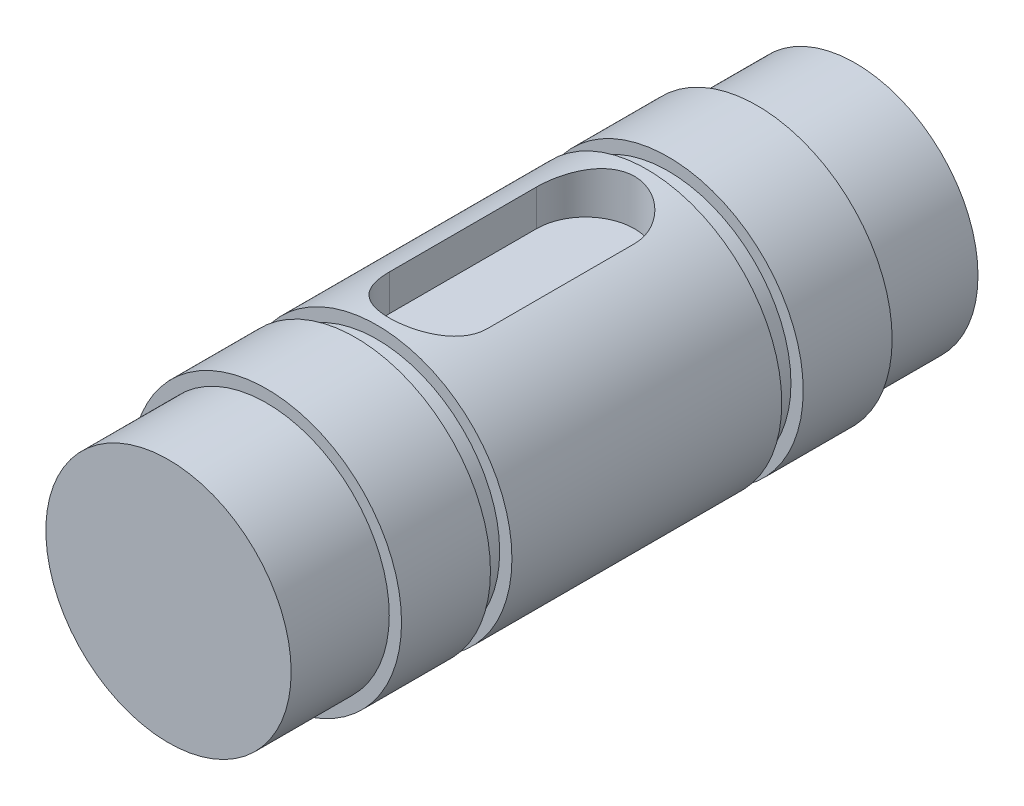
ISO-10303-21;
HEADER;
FILE_DESCRIPTION(('STEP AP214'),'2;1');
FILE_NAME('part.step','',(''),(''),'','','');
FILE_SCHEMA(('AUTOMOTIVE_DESIGN { 1 0 10303 214 1 1 1 1 }'));
ENDSEC;
DATA;
#1=APPLICATION_CONTEXT('core data for automotive mechanical design processes');
#2=APPLICATION_PROTOCOL_DEFINITION('international standard','automotive_design',2000,#1);
#3=PRODUCT_CONTEXT('',#1,'mechanical');
#4=PRODUCT('Part','Part','',(#3));
#5=PRODUCT_RELATED_PRODUCT_CATEGORY('part','',(#4));
#6=PRODUCT_DEFINITION_FORMATION('','',#4);
#7=PRODUCT_DEFINITION_CONTEXT('part definition',#1,'design');
#8=PRODUCT_DEFINITION('design','',#6,#7);
#9=PRODUCT_DEFINITION_SHAPE('','',#8);
#10=(LENGTH_UNIT() NAMED_UNIT(*) SI_UNIT(.MILLI.,.METRE.));
#11=(NAMED_UNIT(*) PLANE_ANGLE_UNIT() SI_UNIT($,.RADIAN.));
#12=(NAMED_UNIT(*) SI_UNIT($,.STERADIAN.) SOLID_ANGLE_UNIT());
#13=UNCERTAINTY_MEASURE_WITH_UNIT(LENGTH_MEASURE(1.E-05),#10,'distance_accuracy_value','');
#14=(GEOMETRIC_REPRESENTATION_CONTEXT(3) GLOBAL_UNCERTAINTY_ASSIGNED_CONTEXT((#13)) GLOBAL_UNIT_ASSIGNED_CONTEXT((#10,
#11,#12)) REPRESENTATION_CONTEXT('',''));
#15=CARTESIAN_POINT('',(0.,0.,0.));
#16=DIRECTION('',(0.,0.,1.));
#17=DIRECTION('',(1.,0.,0.));
#18=AXIS2_PLACEMENT_3D('',#15,#16,#17);
#19=CARTESIAN_POINT('',(0.,0.,20.));
#20=DIRECTION('',(0.,0.,-1.));
#21=DIRECTION('',(-1.,0.,0.));
#22=AXIS2_PLACEMENT_3D('',#19,#20,#21);
#23=CYLINDRICAL_SURFACE('',#22,11.);
#24=CARTESIAN_POINT('',(0.,0.,11.));
#25=DIRECTION('',(0.,0.,1.));
#26=DIRECTION('',(1.,0.,0.));
#27=AXIS2_PLACEMENT_3D('',#24,#25,#26);
#28=CIRCLE('',#27,11.);
#29=CARTESIAN_POINT('',(11.,0.,11.));
#30=VERTEX_POINT('',#29);
#31=EDGE_CURVE('E113',#30,#30,#28,.T.);
#32=ORIENTED_EDGE('',*,*,#31,.F.);
#33=EDGE_LOOP('',(#32));
#34=FACE_BOUND('',#33,.T.);
#35=CARTESIAN_POINT('',(4.,10.2469507659596,-6.));
#36=CARTESIAN_POINT('',(4.00001506629618,10.2469313120545,-6.10847755884303));
#37=CARTESIAN_POINT('',(3.99558759654818,10.2486728711533,-6.21694440137105));
#38=CARTESIAN_POINT('',(3.97796511816532,10.2555329689245,-6.43302261836809));
#39=CARTESIAN_POINT('',(3.96477288617617,10.260650438117,-6.54063425284187));
#40=CARTESIAN_POINT('',(3.92979740032967,10.2740947544928,-6.75387727573529));
#41=CARTESIAN_POINT('',(3.90804329121767,10.2824107118169,-6.85951412168963));
#42=CARTESIAN_POINT('',(3.85617600406601,10.3019741161438,-7.06841189769306));
#43=CARTESIAN_POINT('',(3.82606243666696,10.3132216996918,-7.17167271683103));
#44=CARTESIAN_POINT('',(3.72361404417548,10.3508476988465,-7.47667611577799));
#45=CARTESIAN_POINT('',(3.6391113549248,10.3811339859163,-7.67400157027245));
#46=CARTESIAN_POINT('',(3.44036098803053,10.4486780931695,-8.05172943459006));
#47=CARTESIAN_POINT('',(3.32609068287348,10.485941210624,-8.23211882813923));
#48=CARTESIAN_POINT('',(3.0653542941641,10.5651741933544,-8.57927479117736));
#49=CARTESIAN_POINT('',(2.91773340595898,10.6072762987954,-8.74514569335533));
#50=CARTESIAN_POINT('',(2.59694586086137,10.6903365397361,-9.05039678297012));
#51=CARTESIAN_POINT('',(2.42377439039871,10.731294457945,-9.18977196743197));
#52=CARTESIAN_POINT('',(2.05001939238179,10.8090212550311,-9.44236320126538));
#53=CARTESIAN_POINT('',(1.84874018053143,10.845615877207,-9.55460837161861));
#54=CARTESIAN_POINT('',(1.42859821417924,10.9089021162938,-9.7432716683795));
#55=CARTESIAN_POINT('',(1.20974170951164,10.9355972343031,-9.81970246356845));
#56=CARTESIAN_POINT('',(0.770126116610719,10.9751354864474,-9.93144020430173));
#57=CARTESIAN_POINT('',(0.549808811706299,10.9884992496064,-9.96829749176194));
#58=CARTESIAN_POINT('',(0.105733961474889,11.0017318475325,-10.004798750743));
#59=CARTESIAN_POINT('',(-0.118022575285701,11.0016045658519,-10.0044534314614));
#60=CARTESIAN_POINT('',(-0.551545099906522,10.9882062518061,-9.96748382097402));
#61=CARTESIAN_POINT('',(-0.761477378236625,10.9755475501487,-9.93254965293703));
#62=CARTESIAN_POINT('',(-1.17226394649134,10.9393023123449,-9.83022333682287));
#63=CARTESIAN_POINT('',(-1.37311772136676,10.9157151570485,-9.76282934973016));
#64=CARTESIAN_POINT('',(-1.76343292952034,10.8595473870101,-9.59665837324836));
#65=CARTESIAN_POINT('',(-1.95269147493231,10.8268435212879,-9.49744827250839));
#66=CARTESIAN_POINT('',(-2.31233599066249,10.7557777457742,-9.27082630306202));
#67=CARTESIAN_POINT('',(-2.48271605149533,10.7174140730196,-9.14340564088477));
#68=CARTESIAN_POINT('',(-2.80972574444224,10.6365116612934,-8.85577759248491));
#69=CARTESIAN_POINT('',(-2.96507569246687,10.5938593571807,-8.69414776985871));
#70=CARTESIAN_POINT('',(-3.24700232649086,10.5108815019074,-8.34669408834143));
#71=CARTESIAN_POINT('',(-3.37356836574825,10.4705568158001,-8.16086131697851));
#72=CARTESIAN_POINT('',(-3.54016240956462,10.4149302410634,-7.86558976536919));
#73=CARTESIAN_POINT('',(-3.59223322579723,10.3970384333424,-7.76325823832066));
#74=CARTESIAN_POINT('',(-3.68750228530319,10.3636323383352,-7.5541882051343));
#75=CARTESIAN_POINT('',(-3.73070428236142,10.3481170458825,-7.44745158655047));
#76=CARTESIAN_POINT('',(-3.80779139446806,10.3200005007808,-7.23043618895911));
#77=CARTESIAN_POINT('',(-3.84168714521911,10.3073959242428,-7.12016161572951));
#78=CARTESIAN_POINT('',(-3.8998727091522,10.2855215725494,-6.89682897033679));
#79=CARTESIAN_POINT('',(-3.92416687098899,10.2762502878854,-6.78377218296894));
#80=CARTESIAN_POINT('',(-3.96229165305801,10.2616115978763,-6.5592786141836));
#81=CARTESIAN_POINT('',(-3.97642329254164,10.2561320834074,-6.44790025783854));
#82=CARTESIAN_POINT('',(-3.99528154959869,10.2487922541277,-6.2243510659218));
#83=CARTESIAN_POINT('',(-4.00001800323396,10.2469281542918,-6.11218118266163));
#84=CARTESIAN_POINT('',(-4.,10.2469507659596,-6.));
#85=B_SPLINE_CURVE_WITH_KNOTS('',3,(#35,#36,#37,#38,#39,#40,#41,#42,#43,#44,#45,#46,#47,#48,#49,
#50,#51,#52,#53,#54,#55,#56,#57,#58,#59,#60,#61,#62,#63,#64,#65,#66,#67,#68,#69,#70,#71,#72,#73,
#74,#75,#76,#77,#78,#79,#80,#81,#82,#83,#84),.UNSPECIFIED.,.F.,.F.,(4,2,2,2,2,2,2,2,2,2,2,2,2,2,
2,2,2,2,2,2,2,2,2,2,4),(0.,0.325310395428346,0.650517782781825,0.974627603491258,
1.29875252283213,1.94591304532233,2.59356694227547,3.26854149378252,3.94364336903227,
4.64017640395484,5.33646286474439,6.00434645390944,6.67203778562602,7.30863725983086,
7.94527280491034,8.59097152050376,9.23687178993661,9.9184556128784,10.6002911350355,
10.9485318545547,11.2966248736591,11.6443184006235,11.9918542727889,12.3286166822483,
12.665026340001),.UNSPECIFIED.);
#86=CARTESIAN_POINT('',(4.,10.2469507659596,-6.));
#87=VERTEX_POINT('',#86);
#88=CARTESIAN_POINT('',(-4.,10.2469507659596,-6.));
#89=VERTEX_POINT('',#88);
#90=EDGE_CURVE('E152',#87,#89,#85,.T.);
#91=ORIENTED_EDGE('',*,*,#90,.F.);
#92=DIRECTION('',(0.,0.,-1.));
#93=VECTOR('',#92,1.);
#94=CARTESIAN_POINT('',(4.,10.2469507659596,20.));
#95=LINE('',#94,#93);
#96=CARTESIAN_POINT('',(4.,10.2469507659596,6.));
#97=VERTEX_POINT('',#96);
#98=EDGE_CURVE('E12',#87,#97,#95,.F.);
#99=ORIENTED_EDGE('',*,*,#98,.T.);
#100=CARTESIAN_POINT('',(4.,10.2469507659596,6.));
#101=CARTESIAN_POINT('',(4.00001506629618,10.2469313120545,6.10847755884303));
#102=CARTESIAN_POINT('',(3.99558759654818,10.2486728711533,6.21694440137105));
#103=CARTESIAN_POINT('',(3.97796511816532,10.2555329689245,6.43302261836809));
#104=CARTESIAN_POINT('',(3.96477288617617,10.260650438117,6.54063425284187));
#105=CARTESIAN_POINT('',(3.92979740032967,10.2740947544928,6.75387727573528));
#106=CARTESIAN_POINT('',(3.90804329121767,10.2824107118169,6.85951412168963));
#107=CARTESIAN_POINT('',(3.85617600406601,10.3019741161438,7.06841189769305));
#108=CARTESIAN_POINT('',(3.82606243666696,10.3132216996918,7.17167271683103));
#109=CARTESIAN_POINT('',(3.72361404417548,10.3508476988465,7.47667611577799));
#110=CARTESIAN_POINT('',(3.63911135492481,10.3811339859163,7.67400157027245));
#111=CARTESIAN_POINT('',(3.44036098803054,10.4486780931695,8.05172943459006));
#112=CARTESIAN_POINT('',(3.32609068287348,10.485941210624,8.23211882813923));
#113=CARTESIAN_POINT('',(3.0653542941641,10.5651741933544,8.57927479117736));
#114=CARTESIAN_POINT('',(2.91773340595898,10.6072762987954,8.74514569335533));
#115=CARTESIAN_POINT('',(2.59694586086137,10.690336539736,9.05039678297012));
#116=CARTESIAN_POINT('',(2.42377439039872,10.731294457945,9.18977196743197));
#117=CARTESIAN_POINT('',(2.0500193923818,10.8090212550311,9.44236320126538));
#118=CARTESIAN_POINT('',(1.84874018053143,10.845615877207,9.5546083716186));
#119=CARTESIAN_POINT('',(1.42859821417925,10.9089021162938,9.7432716683795));
#120=CARTESIAN_POINT('',(1.20974170951164,10.9355972343031,9.81970246356844));
#121=CARTESIAN_POINT('',(0.770126116610723,10.9751354864474,9.93144020430173));
#122=CARTESIAN_POINT('',(0.549808811706303,10.9884992496064,9.96829749176194));
#123=CARTESIAN_POINT('',(0.105733961474892,11.0017318475325,10.004798750743));
#124=CARTESIAN_POINT('',(-0.118022575285698,11.0016045658519,10.0044534314614));
#125=CARTESIAN_POINT('',(-0.551545099906519,10.9882062518061,9.96748382097402));
#126=CARTESIAN_POINT('',(-0.761477378236622,10.9755475501487,9.93254965293702));
#127=CARTESIAN_POINT('',(-1.17226394649134,10.9393023123449,9.83022333682286));
#128=CARTESIAN_POINT('',(-1.37311772136676,10.9157151570485,9.76282934973016));
#129=CARTESIAN_POINT('',(-1.76343292952034,10.8595473870101,9.59665837324835));
#130=CARTESIAN_POINT('',(-1.95269147493231,10.8268435212879,9.49744827250838));
#131=CARTESIAN_POINT('',(-2.31233599066249,10.7557777457742,9.27082630306202));
#132=CARTESIAN_POINT('',(-2.48271605149532,10.7174140730196,9.14340564088477));
#133=CARTESIAN_POINT('',(-2.80972574444224,10.6365116612934,8.8557775924849));
#134=CARTESIAN_POINT('',(-2.96507569246687,10.5938593571807,8.69414776985871));
#135=CARTESIAN_POINT('',(-3.24700232649085,10.5108815019074,8.34669408834142));
#136=CARTESIAN_POINT('',(-3.37356836574825,10.4705568158001,8.16086131697851));
#137=CARTESIAN_POINT('',(-3.54016240956462,10.4149302410634,7.86558976536919));
#138=CARTESIAN_POINT('',(-3.59223322579723,10.3970384333424,7.76325823832065));
#139=CARTESIAN_POINT('',(-3.68750228530319,10.3636323383352,7.5541882051343));
#140=CARTESIAN_POINT('',(-3.73070428236142,10.3481170458825,7.44745158655047));
#141=CARTESIAN_POINT('',(-3.80779139446805,10.3200005007808,7.2304361889591));
#142=CARTESIAN_POINT('',(-3.8416871452191,10.3073959242428,7.1201616157295));
#143=CARTESIAN_POINT('',(-3.8998727091522,10.2855215725494,6.89682897033679));
#144=CARTESIAN_POINT('',(-3.92416687098898,10.2762502878854,6.78377218296893));
#145=CARTESIAN_POINT('',(-3.96229165305801,10.2616115978763,6.55927861418359));
#146=CARTESIAN_POINT('',(-3.97642329254164,10.2561320834074,6.44790025783854));
#147=CARTESIAN_POINT('',(-3.99528154959869,10.2487922541277,6.2243510659218));
#148=CARTESIAN_POINT('',(-4.00001800323396,10.2469281542918,6.11218118266163));
#149=CARTESIAN_POINT('',(-4.,10.2469507659596,6.));
#150=B_SPLINE_CURVE_WITH_KNOTS('',3,(#100,#101,#102,#103,#104,#105,#106,#107,#108,#109,#110,
#111,#112,#113,#114,#115,#116,#117,#118,#119,#120,#121,#122,#123,#124,#125,#126,#127,#128,#129,
#130,#131,#132,#133,#134,#135,#136,#137,#138,#139,#140,#141,#142,#143,#144,#145,#146,#147,#148,
#149),.UNSPECIFIED.,.F.,.F.,(4,2,2,2,2,2,2,2,2,2,2,2,2,2,2,2,2,2,2,2,2,2,2,2,4),(0.,
0.325310395428347,0.650517782781825,0.974627603491257,1.29875252283213,1.94591304532233,
2.59356694227547,3.26854149378252,3.94364336903227,4.64017640395484,5.33646286474438,
6.00434645390944,6.67203778562602,7.30863725983085,7.94527280491034,8.59097152050376,
9.23687178993661,9.91845561287839,10.6002911350355,10.9485318545547,11.2966248736591,
11.6443184006235,11.9918542727889,12.3286166822483,12.665026340001),.UNSPECIFIED.);
#151=CARTESIAN_POINT('',(-4.,10.2469507659596,6.));
#152=VERTEX_POINT('',#151);
#153=EDGE_CURVE('E51',#97,#152,#150,.T.);
#154=ORIENTED_EDGE('',*,*,#153,.T.);
#155=DIRECTION('',(0.,0.,-1.));
#156=VECTOR('',#155,1.);
#157=CARTESIAN_POINT('',(-4.,10.2469507659596,20.));
#158=LINE('',#157,#156);
#159=EDGE_CURVE('E66',#89,#152,#158,.F.);
#160=ORIENTED_EDGE('',*,*,#159,.F.);
#161=EDGE_LOOP('',(#91,#99,#154,#160));
#162=FACE_BOUND('',#161,.T.);
#163=CARTESIAN_POINT('',(0.,0.,-11.));
#164=DIRECTION('',(0.,0.,-1.));
#165=DIRECTION('',(-1.,0.,0.));
#166=AXIS2_PLACEMENT_3D('',#163,#164,#165);
#167=CIRCLE('',#166,11.);
#168=CARTESIAN_POINT('',(-11.,0.,-11.));
#169=VERTEX_POINT('',#168);
#170=EDGE_CURVE('E225',#169,#169,#167,.T.);
#171=ORIENTED_EDGE('',*,*,#170,.F.);
#172=EDGE_LOOP('',(#171));
#173=FACE_BOUND('',#172,.T.);
#174=ADVANCED_FACE('F40',(#34,#162,#173),#23,.T.);
#175=CARTESIAN_POINT('',(0.,0.,12.75));
#176=DIRECTION('',(0.,0.,1.));
#177=DIRECTION('',(1.,0.,0.));
#178=AXIS2_PLACEMENT_3D('',#175,#176,#177);
#179=CIRCLE('',#178,11.);
#180=CARTESIAN_POINT('',(11.,0.,12.75));
#181=VERTEX_POINT('',#180);
#182=EDGE_CURVE('E109',#181,#181,#179,.T.);
#183=ORIENTED_EDGE('',*,*,#182,.T.);
#184=EDGE_LOOP('',(#183));
#185=FACE_BOUND('',#184,.T.);
#186=CARTESIAN_POINT('',(0.,0.,20.));
#187=DIRECTION('',(0.,0.,1.));
#188=DIRECTION('',(1.,0.,0.));
#189=AXIS2_PLACEMENT_3D('',#186,#187,#188);
#190=CIRCLE('',#189,11.);
#191=CARTESIAN_POINT('',(11.,0.,20.));
#192=VERTEX_POINT('',#191);
#193=EDGE_CURVE('E147',#192,#192,#190,.T.);
#194=ORIENTED_EDGE('',*,*,#193,.F.);
#195=EDGE_LOOP('',(#194));
#196=FACE_BOUND('',#195,.T.);
#197=ADVANCED_FACE('F42',(#185,#196),#23,.T.);
#198=CARTESIAN_POINT('',(0.,0.,20.));
#199=DIRECTION('',(0.,0.,1.));
#200=DIRECTION('',(1.,0.,0.));
#201=AXIS2_PLACEMENT_3D('',#198,#199,#200);
#202=PLANE('',#201);
#203=CARTESIAN_POINT('',(0.,0.,20.));
#204=DIRECTION('',(0.,0.,1.));
#205=DIRECTION('',(1.,0.,0.));
#206=AXIS2_PLACEMENT_3D('',#203,#204,#205);
#207=CIRCLE('',#206,10.);
#208=CARTESIAN_POINT('',(10.,0.,20.));
#209=VERTEX_POINT('',#208);
#210=EDGE_CURVE('E148',#209,#209,#207,.T.);
#211=ORIENTED_EDGE('',*,*,#210,.F.);
#212=EDGE_LOOP('',(#211));
#213=FACE_BOUND('',#212,.T.);
#214=ORIENTED_EDGE('',*,*,#193,.T.);
#215=EDGE_LOOP('',(#214));
#216=FACE_BOUND('',#215,.T.);
#217=ADVANCED_FACE('F195',(#213,#216),#202,.T.);
#218=CARTESIAN_POINT('',(0.,0.,28.));
#219=DIRECTION('',(0.,0.,-1.));
#220=DIRECTION('',(-1.,0.,0.));
#221=AXIS2_PLACEMENT_3D('',#218,#219,#220);
#222=CYLINDRICAL_SURFACE('',#221,10.);
#223=CARTESIAN_POINT('',(0.,0.,28.));
#224=DIRECTION('',(0.,0.,1.));
#225=DIRECTION('',(1.,0.,0.));
#226=AXIS2_PLACEMENT_3D('',#223,#224,#225);
#227=CIRCLE('',#226,10.);
#228=CARTESIAN_POINT('',(10.,0.,28.));
#229=VERTEX_POINT('',#228);
#230=EDGE_CURVE('E140',#229,#229,#227,.T.);
#231=ORIENTED_EDGE('',*,*,#230,.F.);
#232=EDGE_LOOP('',(#231));
#233=FACE_BOUND('',#232,.T.);
#234=ORIENTED_EDGE('',*,*,#210,.T.);
#235=EDGE_LOOP('',(#234));
#236=FACE_BOUND('',#235,.T.);
#237=ADVANCED_FACE('F192',(#233,#236),#222,.T.);
#238=CARTESIAN_POINT('',(0.,0.,28.));
#239=DIRECTION('',(0.,0.,1.));
#240=DIRECTION('',(1.,0.,0.));
#241=AXIS2_PLACEMENT_3D('',#238,#239,#240);
#242=PLANE('',#241);
#243=ORIENTED_EDGE('',*,*,#230,.T.);
#244=EDGE_LOOP('',(#243));
#245=FACE_BOUND('',#244,.T.);
#246=ADVANCED_FACE('F188',(#245),#242,.T.);
#247=CARTESIAN_POINT('',(0.,0.,12.75));
#248=DIRECTION('',(0.,0.,1.));
#249=DIRECTION('',(1.,0.,0.));
#250=AXIS2_PLACEMENT_3D('',#247,#248,#249);
#251=PLANE('',#250);
#252=CARTESIAN_POINT('',(0.,0.,12.75));
#253=DIRECTION('',(0.,0.,1.));
#254=DIRECTION('',(1.,0.,0.));
#255=AXIS2_PLACEMENT_3D('',#252,#253,#254);
#256=CIRCLE('',#255,10.);
#257=CARTESIAN_POINT('',(10.,0.,12.75));
#258=VERTEX_POINT('',#257);
#259=EDGE_CURVE('E229',#258,#258,#256,.T.);
#260=ORIENTED_EDGE('',*,*,#259,.T.);
#261=EDGE_LOOP('',(#260));
#262=FACE_BOUND('',#261,.T.);
#263=ORIENTED_EDGE('',*,*,#182,.F.);
#264=EDGE_LOOP('',(#263));
#265=FACE_BOUND('',#264,.T.);
#266=ADVANCED_FACE('F191',(#262,#265),#251,.F.);
#267=CARTESIAN_POINT('',(0.,0.,11.));
#268=DIRECTION('',(0.,0.,1.));
#269=DIRECTION('',(1.,0.,0.));
#270=AXIS2_PLACEMENT_3D('',#267,#268,#269);
#271=PLANE('',#270);
#272=CARTESIAN_POINT('',(0.,0.,11.));
#273=DIRECTION('',(0.,0.,1.));
#274=DIRECTION('',(1.,0.,0.));
#275=AXIS2_PLACEMENT_3D('',#272,#273,#274);
#276=CIRCLE('',#275,10.);
#277=CARTESIAN_POINT('',(10.,0.,11.));
#278=VERTEX_POINT('',#277);
#279=EDGE_CURVE('E116',#278,#278,#276,.T.);
#280=ORIENTED_EDGE('',*,*,#279,.F.);
#281=EDGE_LOOP('',(#280));
#282=FACE_BOUND('',#281,.T.);
#283=ORIENTED_EDGE('',*,*,#31,.T.);
#284=EDGE_LOOP('',(#283));
#285=FACE_BOUND('',#284,.T.);
#286=ADVANCED_FACE('F252',(#282,#285),#271,.T.);
#287=CARTESIAN_POINT('',(0.,0.,12.75));
#288=DIRECTION('',(0.,0.,-1.));
#289=DIRECTION('',(-1.,0.,0.));
#290=AXIS2_PLACEMENT_3D('',#287,#288,#289);
#291=CYLINDRICAL_SURFACE('',#290,10.);
#292=ORIENTED_EDGE('',*,*,#259,.F.);
#293=EDGE_LOOP('',(#292));
#294=FACE_BOUND('',#293,.T.);
#295=ORIENTED_EDGE('',*,*,#279,.T.);
#296=EDGE_LOOP('',(#295));
#297=FACE_BOUND('',#296,.T.);
#298=ADVANCED_FACE('F251',(#294,#297),#291,.T.);
#299=CARTESIAN_POINT('',(0.,7.3,0.));
#300=DIRECTION('',(0.,1.,0.));
#301=DIRECTION('',(0.,0.,1.));
#302=AXIS2_PLACEMENT_3D('',#299,#300,#301);
#303=PLANE('',#302);
#304=DIRECTION('',(0.,0.,-1.));
#305=VECTOR('',#304,1.);
#306=CARTESIAN_POINT('',(4.,7.3,0.));
#307=LINE('',#306,#305);
#308=CARTESIAN_POINT('',(4.,7.3,6.));
#309=VERTEX_POINT('',#308);
#310=CARTESIAN_POINT('',(4.,7.3,-6.));
#311=VERTEX_POINT('',#310);
#312=EDGE_CURVE('E96',#309,#311,#307,.T.);
#313=ORIENTED_EDGE('',*,*,#312,.T.);
#314=CARTESIAN_POINT('',(0.,7.3,-6.));
#315=DIRECTION('',(0.,1.,0.));
#316=DIRECTION('',(0.,0.,1.));
#317=AXIS2_PLACEMENT_3D('',#314,#315,#316);
#318=CIRCLE('',#317,4.);
#319=CARTESIAN_POINT('',(-4.,7.3,-6.));
#320=VERTEX_POINT('',#319);
#321=EDGE_CURVE('E86',#320,#311,#318,.F.);
#322=ORIENTED_EDGE('',*,*,#321,.F.);
#323=DIRECTION('',(0.,0.,-1.));
#324=VECTOR('',#323,1.);
#325=CARTESIAN_POINT('',(-4.,7.3,0.));
#326=LINE('',#325,#324);
#327=CARTESIAN_POINT('',(-4.,7.3,6.));
#328=VERTEX_POINT('',#327);
#329=EDGE_CURVE('E95',#328,#320,#326,.T.);
#330=ORIENTED_EDGE('',*,*,#329,.F.);
#331=CARTESIAN_POINT('',(0.,7.3,6.));
#332=DIRECTION('',(0.,1.,0.));
#333=DIRECTION('',(0.,0.,1.));
#334=AXIS2_PLACEMENT_3D('',#331,#332,#333);
#335=CIRCLE('',#334,4.);
#336=EDGE_CURVE('E104',#328,#309,#335,.T.);
#337=ORIENTED_EDGE('',*,*,#336,.T.);
#338=EDGE_LOOP('',(#313,#322,#330,#337));
#339=FACE_BOUND('',#338,.T.);
#340=ADVANCED_FACE('F106',(#339),#303,.T.);
#341=CARTESIAN_POINT('',(-4.,7.3,0.));
#342=DIRECTION('',(1.,0.,0.));
#343=DIRECTION('',(0.,0.,-1.));
#344=AXIS2_PLACEMENT_3D('',#341,#342,#343);
#345=PLANE('',#344);
#346=ORIENTED_EDGE('',*,*,#159,.T.);
#347=DIRECTION('',(0.,1.,0.));
#348=VECTOR('',#347,1.);
#349=CARTESIAN_POINT('',(-4.,7.3,6.));
#350=LINE('',#349,#348);
#351=EDGE_CURVE('E127',#328,#152,#350,.T.);
#352=ORIENTED_EDGE('',*,*,#351,.F.);
#353=ORIENTED_EDGE('',*,*,#329,.T.);
#354=DIRECTION('',(0.,1.,0.));
#355=VECTOR('',#354,1.);
#356=CARTESIAN_POINT('',(-4.,7.3,-6.));
#357=LINE('',#356,#355);
#358=EDGE_CURVE('E90',#320,#89,#357,.T.);
#359=ORIENTED_EDGE('',*,*,#358,.T.);
#360=EDGE_LOOP('',(#346,#352,#353,#359));
#361=FACE_BOUND('',#360,.T.);
#362=ADVANCED_FACE('F169',(#361),#345,.T.);
#363=CARTESIAN_POINT('',(0.,7.3,6.));
#364=DIRECTION('',(0.,1.,0.));
#365=DIRECTION('',(0.,0.,1.));
#366=AXIS2_PLACEMENT_3D('',#363,#364,#365);
#367=CYLINDRICAL_SURFACE('',#366,4.);
#368=DIRECTION('',(0.,1.,0.));
#369=VECTOR('',#368,1.);
#370=CARTESIAN_POINT('',(4.,7.3,6.));
#371=LINE('',#370,#369);
#372=EDGE_CURVE('E123',#309,#97,#371,.T.);
#373=ORIENTED_EDGE('',*,*,#372,.F.);
#374=ORIENTED_EDGE('',*,*,#336,.F.);
#375=ORIENTED_EDGE('',*,*,#351,.T.);
#376=ORIENTED_EDGE('',*,*,#153,.F.);
#377=EDGE_LOOP('',(#373,#374,#375,#376));
#378=FACE_BOUND('',#377,.T.);
#379=ADVANCED_FACE('F173',(#378),#367,.F.);
#380=CARTESIAN_POINT('',(4.,7.3,0.));
#381=DIRECTION('',(1.,0.,0.));
#382=DIRECTION('',(0.,0.,-1.));
#383=AXIS2_PLACEMENT_3D('',#380,#381,#382);
#384=PLANE('',#383);
#385=DIRECTION('',(0.,1.,0.));
#386=VECTOR('',#385,1.);
#387=CARTESIAN_POINT('',(4.,7.3,-6.));
#388=LINE('',#387,#386);
#389=EDGE_CURVE('E89',#311,#87,#388,.T.);
#390=ORIENTED_EDGE('',*,*,#389,.F.);
#391=ORIENTED_EDGE('',*,*,#312,.F.);
#392=ORIENTED_EDGE('',*,*,#372,.T.);
#393=ORIENTED_EDGE('',*,*,#98,.F.);
#394=EDGE_LOOP('',(#390,#391,#392,#393));
#395=FACE_BOUND('',#394,.T.);
#396=ADVANCED_FACE('F101',(#395),#384,.F.);
#397=CARTESIAN_POINT('',(0.,7.3,-6.));
#398=DIRECTION('',(0.,1.,0.));
#399=DIRECTION('',(0.,0.,1.));
#400=AXIS2_PLACEMENT_3D('',#397,#398,#399);
#401=CYLINDRICAL_SURFACE('',#400,4.);
#402=ORIENTED_EDGE('',*,*,#389,.T.);
#403=ORIENTED_EDGE('',*,*,#90,.T.);
#404=ORIENTED_EDGE('',*,*,#358,.F.);
#405=ORIENTED_EDGE('',*,*,#321,.T.);
#406=EDGE_LOOP('',(#402,#403,#404,#405));
#407=FACE_BOUND('',#406,.T.);
#408=ADVANCED_FACE('F88',(#407),#401,.F.);
#409=CARTESIAN_POINT('',(0.,0.,-12.75));
#410=DIRECTION('',(0.,0.,-1.));
#411=DIRECTION('',(-1.,0.,0.));
#412=AXIS2_PLACEMENT_3D('',#409,#410,#411);
#413=PLANE('',#412);
#414=CARTESIAN_POINT('',(0.,0.,-12.75));
#415=DIRECTION('',(0.,0.,1.));
#416=DIRECTION('',(1.,0.,0.));
#417=AXIS2_PLACEMENT_3D('',#414,#415,#416);
#418=CIRCLE('',#417,10.);
#419=CARTESIAN_POINT('',(10.,0.,-12.75));
#420=VERTEX_POINT('',#419);
#421=EDGE_CURVE('E231',#420,#420,#418,.T.);
#422=ORIENTED_EDGE('',*,*,#421,.F.);
#423=EDGE_LOOP('',(#422));
#424=FACE_BOUND('',#423,.T.);
#425=CARTESIAN_POINT('',(0.,0.,-12.75));
#426=DIRECTION('',(0.,0.,-1.));
#427=DIRECTION('',(-1.,0.,0.));
#428=AXIS2_PLACEMENT_3D('',#425,#426,#427);
#429=CIRCLE('',#428,11.);
#430=CARTESIAN_POINT('',(-11.,0.,-12.75));
#431=VERTEX_POINT('',#430);
#432=EDGE_CURVE('E45',#431,#431,#429,.T.);
#433=ORIENTED_EDGE('',*,*,#432,.F.);
#434=EDGE_LOOP('',(#433));
#435=FACE_BOUND('',#434,.T.);
#436=ADVANCED_FACE('F168',(#424,#435),#413,.F.);
#437=CARTESIAN_POINT('',(0.,0.,-11.));
#438=DIRECTION('',(0.,0.,-1.));
#439=DIRECTION('',(-1.,0.,0.));
#440=AXIS2_PLACEMENT_3D('',#437,#438,#439);
#441=PLANE('',#440);
#442=CARTESIAN_POINT('',(0.,0.,-11.));
#443=DIRECTION('',(0.,0.,1.));
#444=DIRECTION('',(1.,0.,0.));
#445=AXIS2_PLACEMENT_3D('',#442,#443,#444);
#446=CIRCLE('',#445,10.);
#447=CARTESIAN_POINT('',(10.,0.,-11.));
#448=VERTEX_POINT('',#447);
#449=EDGE_CURVE('E236',#448,#448,#446,.T.);
#450=ORIENTED_EDGE('',*,*,#449,.T.);
#451=EDGE_LOOP('',(#450));
#452=FACE_BOUND('',#451,.T.);
#453=ORIENTED_EDGE('',*,*,#170,.T.);
#454=EDGE_LOOP('',(#453));
#455=FACE_BOUND('',#454,.T.);
#456=ADVANCED_FACE('F262',(#452,#455),#441,.T.);
#457=CARTESIAN_POINT('',(0.,0.,-12.75));
#458=DIRECTION('',(0.,0.,1.));
#459=DIRECTION('',(1.,0.,0.));
#460=AXIS2_PLACEMENT_3D('',#457,#458,#459);
#461=CYLINDRICAL_SURFACE('',#460,10.);
#462=ORIENTED_EDGE('',*,*,#421,.T.);
#463=EDGE_LOOP('',(#462));
#464=FACE_BOUND('',#463,.T.);
#465=ORIENTED_EDGE('',*,*,#449,.F.);
#466=EDGE_LOOP('',(#465));
#467=FACE_BOUND('',#466,.T.);
#468=ADVANCED_FACE('F178',(#464,#467),#461,.T.);
#469=CARTESIAN_POINT('',(0.,0.,-28.));
#470=DIRECTION('',(0.,0.,-1.));
#471=DIRECTION('',(1.,0.,0.));
#472=AXIS2_PLACEMENT_3D('',#469,#470,#471);
#473=PLANE('',#472);
#474=CARTESIAN_POINT('',(0.,0.,-28.));
#475=DIRECTION('',(0.,0.,1.));
#476=DIRECTION('',(1.,0.,0.));
#477=AXIS2_PLACEMENT_3D('',#474,#475,#476);
#478=CIRCLE('',#477,10.);
#479=CARTESIAN_POINT('',(10.,0.,-28.));
#480=VERTEX_POINT('',#479);
#481=EDGE_CURVE('E126',#480,#480,#478,.T.);
#482=ORIENTED_EDGE('',*,*,#481,.F.);
#483=EDGE_LOOP('',(#482));
#484=FACE_BOUND('',#483,.T.);
#485=ADVANCED_FACE('F174',(#484),#473,.T.);
#486=CARTESIAN_POINT('',(0.,0.,-28.));
#487=DIRECTION('',(0.,0.,1.));
#488=DIRECTION('',(-1.,0.,0.));
#489=AXIS2_PLACEMENT_3D('',#486,#487,#488);
#490=CYLINDRICAL_SURFACE('',#489,10.);
#491=ORIENTED_EDGE('',*,*,#481,.T.);
#492=EDGE_LOOP('',(#491));
#493=FACE_BOUND('',#492,.T.);
#494=CARTESIAN_POINT('',(0.,0.,-20.));
#495=DIRECTION('',(0.,0.,1.));
#496=DIRECTION('',(1.,0.,0.));
#497=AXIS2_PLACEMENT_3D('',#494,#495,#496);
#498=CIRCLE('',#497,10.);
#499=CARTESIAN_POINT('',(10.,0.,-20.));
#500=VERTEX_POINT('',#499);
#501=EDGE_CURVE('E136',#500,#500,#498,.T.);
#502=ORIENTED_EDGE('',*,*,#501,.F.);
#503=EDGE_LOOP('',(#502));
#504=FACE_BOUND('',#503,.T.);
#505=ADVANCED_FACE('F177',(#493,#504),#490,.T.);
#506=CARTESIAN_POINT('',(0.,0.,-20.));
#507=DIRECTION('',(0.,0.,-1.));
#508=DIRECTION('',(1.,0.,0.));
#509=AXIS2_PLACEMENT_3D('',#506,#507,#508);
#510=PLANE('',#509);
#511=ORIENTED_EDGE('',*,*,#501,.T.);
#512=EDGE_LOOP('',(#511));
#513=FACE_BOUND('',#512,.T.);
#514=CARTESIAN_POINT('',(0.,0.,-20.));
#515=DIRECTION('',(0.,0.,1.));
#516=DIRECTION('',(1.,0.,0.));
#517=AXIS2_PLACEMENT_3D('',#514,#515,#516);
#518=CIRCLE('',#517,11.);
#519=CARTESIAN_POINT('',(11.,0.,-20.));
#520=VERTEX_POINT('',#519);
#521=EDGE_CURVE('E135',#520,#520,#518,.T.);
#522=ORIENTED_EDGE('',*,*,#521,.F.);
#523=EDGE_LOOP('',(#522));
#524=FACE_BOUND('',#523,.T.);
#525=ADVANCED_FACE('F182',(#513,#524),#510,.T.);
#526=ORIENTED_EDGE('',*,*,#432,.T.);
#527=EDGE_LOOP('',(#526));
#528=FACE_BOUND('',#527,.T.);
#529=ORIENTED_EDGE('',*,*,#521,.T.);
#530=EDGE_LOOP('',(#529));
#531=FACE_BOUND('',#530,.T.);
#532=ADVANCED_FACE('F186',(#528,#531),#23,.T.);
#533=CLOSED_SHELL('',(#174,#197,#217,#237,#246,#266,#286,#298,#340,#362,#379,#396,#408,#436,
#456,#468,#485,#505,#525,#532));
#534=MANIFOLD_SOLID_BREP('B2',#533);
#535=ADVANCED_BREP_SHAPE_REPRESENTATION('',(#18,#534),#14);
#536=SHAPE_DEFINITION_REPRESENTATION(#9,#535);
ENDSEC;
END-ISO-10303-21;
